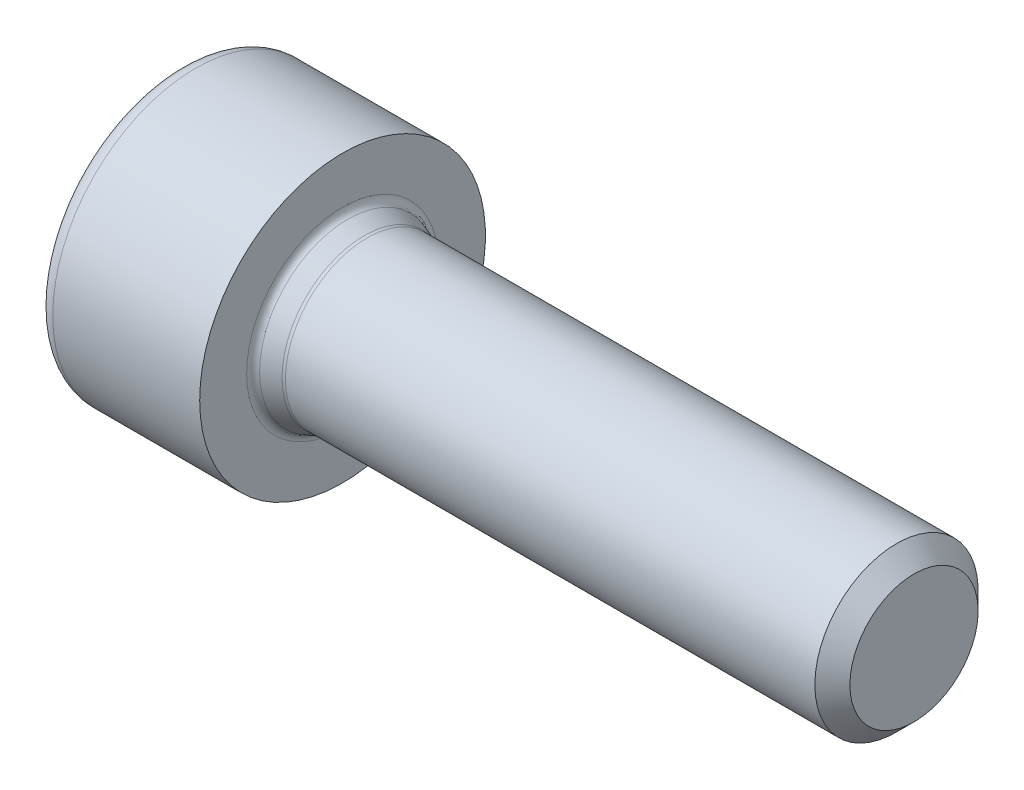
ISO-10303-21;
HEADER;
FILE_DESCRIPTION(('STEP AP214'),'2;1');
FILE_NAME('part.step','',(''),(''),'','','');
FILE_SCHEMA(('AUTOMOTIVE_DESIGN { 1 0 10303 214 1 1 1 1 }'));
ENDSEC;
DATA;
#1=APPLICATION_CONTEXT('core data for automotive mechanical design processes');
#2=APPLICATION_PROTOCOL_DEFINITION('international standard','automotive_design',2000,#1);
#3=PRODUCT_CONTEXT('',#1,'mechanical');
#4=PRODUCT('Part','Part','',(#3));
#5=PRODUCT_RELATED_PRODUCT_CATEGORY('part','',(#4));
#6=PRODUCT_DEFINITION_FORMATION('','',#4);
#7=PRODUCT_DEFINITION_CONTEXT('part definition',#1,'design');
#8=PRODUCT_DEFINITION('design','',#6,#7);
#9=PRODUCT_DEFINITION_SHAPE('','',#8);
#10=(LENGTH_UNIT() NAMED_UNIT(*) SI_UNIT(.MILLI.,.METRE.));
#11=(NAMED_UNIT(*) PLANE_ANGLE_UNIT() SI_UNIT($,.RADIAN.));
#12=(NAMED_UNIT(*) SI_UNIT($,.STERADIAN.) SOLID_ANGLE_UNIT());
#13=UNCERTAINTY_MEASURE_WITH_UNIT(LENGTH_MEASURE(1.E-05),#10,'distance_accuracy_value','');
#14=(GEOMETRIC_REPRESENTATION_CONTEXT(3) GLOBAL_UNCERTAINTY_ASSIGNED_CONTEXT((#13)) GLOBAL_UNIT_ASSIGNED_CONTEXT((#10,
#11,#12)) REPRESENTATION_CONTEXT('',''));
#15=CARTESIAN_POINT('',(0.,0.,0.));
#16=DIRECTION('',(0.,0.,1.));
#17=DIRECTION('',(1.,0.,0.));
#18=AXIS2_PLACEMENT_3D('',#15,#16,#17);
#19=CARTESIAN_POINT('',(-2.,0.,0.));
#20=DIRECTION('',(-1.,0.,0.));
#21=DIRECTION('',(0.,0.,1.));
#22=AXIS2_PLACEMENT_3D('',#19,#20,#21);
#23=CONICAL_SURFACE('',#22,1.50000000000006,1.04719755119661);
#24=CARTESIAN_POINT('',(-1.13397459621556,0.,0.));
#25=VERTEX_POINT('',#24);
#26=VERTEX_LOOP('',#25);
#27=FACE_BOUND('',#26,.T.);
#28=CARTESIAN_POINT('',(-2.,0.,0.));
#29=DIRECTION('',(-1.,0.,0.));
#30=DIRECTION('',(0.,0.,1.));
#31=AXIS2_PLACEMENT_3D('',#28,#29,#30);
#32=CIRCLE('',#31,1.50000000000006);
#33=CARTESIAN_POINT('',(-2.,0.,1.50000000000003));
#34=VERTEX_POINT('',#33);
#35=CARTESIAN_POINT('',(-2.,-1.29903810567668,0.75000000000003));
#36=VERTEX_POINT('',#35);
#37=EDGE_CURVE('E121',#34,#36,#32,.F.);
#38=ORIENTED_EDGE('',*,*,#37,.F.);
#39=CARTESIAN_POINT('',(-2.,0.,0.));
#40=DIRECTION('',(-1.,0.,0.));
#41=DIRECTION('',(0.,0.,1.));
#42=AXIS2_PLACEMENT_3D('',#39,#40,#41);
#43=CIRCLE('',#42,1.50000000000006);
#44=CARTESIAN_POINT('',(-2.,1.29903810567668,0.750000000000031));
#45=VERTEX_POINT('',#44);
#46=EDGE_CURVE('E239',#45,#34,#43,.F.);
#47=ORIENTED_EDGE('',*,*,#46,.F.);
#48=CARTESIAN_POINT('',(-2.,0.,0.));
#49=DIRECTION('',(-1.,0.,0.));
#50=DIRECTION('',(0.,0.,1.));
#51=AXIS2_PLACEMENT_3D('',#48,#49,#50);
#52=CIRCLE('',#51,1.50000000000006);
#53=CARTESIAN_POINT('',(-2.,1.29903810567668,-0.75000000000003));
#54=VERTEX_POINT('',#53);
#55=EDGE_CURVE('E106',#54,#45,#52,.F.);
#56=ORIENTED_EDGE('',*,*,#55,.F.);
#57=CARTESIAN_POINT('',(-2.,0.,0.));
#58=DIRECTION('',(-1.,0.,0.));
#59=DIRECTION('',(0.,0.,1.));
#60=AXIS2_PLACEMENT_3D('',#57,#58,#59);
#61=CIRCLE('',#60,1.50000000000006);
#62=CARTESIAN_POINT('',(-2.,0.,-1.50000000000003));
#63=VERTEX_POINT('',#62);
#64=EDGE_CURVE('E104',#63,#54,#61,.F.);
#65=ORIENTED_EDGE('',*,*,#64,.F.);
#66=CARTESIAN_POINT('',(-2.,0.,0.));
#67=DIRECTION('',(-1.,0.,0.));
#68=DIRECTION('',(0.,0.,1.));
#69=AXIS2_PLACEMENT_3D('',#66,#67,#68);
#70=CIRCLE('',#69,1.50000000000006);
#71=CARTESIAN_POINT('',(-2.,-1.29903810567668,-0.75000000000003));
#72=VERTEX_POINT('',#71);
#73=EDGE_CURVE('E101',#72,#63,#70,.F.);
#74=ORIENTED_EDGE('',*,*,#73,.F.);
#75=CARTESIAN_POINT('',(-2.,0.,0.));
#76=DIRECTION('',(-1.,0.,0.));
#77=DIRECTION('',(0.,0.,1.));
#78=AXIS2_PLACEMENT_3D('',#75,#76,#77);
#79=CIRCLE('',#78,1.50000000000006);
#80=EDGE_CURVE('E243',#36,#72,#79,.F.);
#81=ORIENTED_EDGE('',*,*,#80,.F.);
#82=EDGE_LOOP('',(#38,#47,#56,#65,#74,#81));
#83=FACE_BOUND('',#82,.T.);
#84=ADVANCED_FACE('F16',(#27,#83),#23,.F.);
#85=CARTESIAN_POINT('',(-2.,1.5,0.));
#86=DIRECTION('',(-1.,0.,0.));
#87=DIRECTION('',(0.,0.,1.));
#88=AXIS2_PLACEMENT_3D('',#85,#86,#87);
#89=PLANE('',#88);
#90=DIRECTION('',(0.,1.,0.));
#91=VECTOR('',#90,1.);
#92=CARTESIAN_POINT('',(-2.,-0.86602540378444,-1.5));
#93=LINE('',#92,#91);
#94=CARTESIAN_POINT('',(-2.,-0.86602540378444,-1.5));
#95=VERTEX_POINT('',#94);
#96=EDGE_CURVE('E116',#95,#63,#93,.T.);
#97=ORIENTED_EDGE('',*,*,#96,.F.);
#98=DIRECTION('',(0.,-0.500000000000009,0.866025403784433));
#99=VECTOR('',#98,1.);
#100=CARTESIAN_POINT('',(-2.,-1.7320508075689,0.));
#101=LINE('',#100,#99);
#102=EDGE_CURVE('E119',#72,#95,#101,.F.);
#103=ORIENTED_EDGE('',*,*,#102,.F.);
#104=ORIENTED_EDGE('',*,*,#73,.T.);
#105=EDGE_LOOP('',(#97,#103,#104));
#106=FACE_BOUND('',#105,.T.);
#107=ADVANCED_FACE('F114',(#106),#89,.T.);
#108=CARTESIAN_POINT('',(-2.,1.5,0.));
#109=DIRECTION('',(-1.,0.,0.));
#110=DIRECTION('',(0.,0.,1.));
#111=AXIS2_PLACEMENT_3D('',#108,#109,#110);
#112=PLANE('',#111);
#113=DIRECTION('',(0.,0.500000000000009,0.866025403784433));
#114=VECTOR('',#113,1.);
#115=CARTESIAN_POINT('',(-2.,-0.86602540378444,1.5));
#116=LINE('',#115,#114);
#117=CARTESIAN_POINT('',(-2.,-0.86602540378444,1.5));
#118=VERTEX_POINT('',#117);
#119=EDGE_CURVE('E357',#118,#36,#116,.F.);
#120=ORIENTED_EDGE('',*,*,#119,.F.);
#121=DIRECTION('',(0.,1.,0.));
#122=VECTOR('',#121,1.);
#123=CARTESIAN_POINT('',(-2.,0.86602540378444,1.5));
#124=LINE('',#123,#122);
#125=EDGE_CURVE('E238',#34,#118,#124,.F.);
#126=ORIENTED_EDGE('',*,*,#125,.F.);
#127=ORIENTED_EDGE('',*,*,#37,.T.);
#128=EDGE_LOOP('',(#120,#126,#127));
#129=FACE_BOUND('',#128,.T.);
#130=ADVANCED_FACE('F407',(#129),#112,.T.);
#131=CARTESIAN_POINT('',(-2.,1.5,0.));
#132=DIRECTION('',(-1.,0.,0.));
#133=DIRECTION('',(0.,0.,1.));
#134=AXIS2_PLACEMENT_3D('',#131,#132,#133);
#135=PLANE('',#134);
#136=DIRECTION('',(0.,-0.500000000000009,0.866025403784433));
#137=VECTOR('',#136,1.);
#138=CARTESIAN_POINT('',(-2.,-1.7320508075689,0.));
#139=LINE('',#138,#137);
#140=CARTESIAN_POINT('',(-2.,-1.7320508075689,0.));
#141=VERTEX_POINT('',#140);
#142=EDGE_CURVE('E145',#141,#72,#139,.F.);
#143=ORIENTED_EDGE('',*,*,#142,.F.);
#144=DIRECTION('',(0.,0.500000000000009,0.866025403784433));
#145=VECTOR('',#144,1.);
#146=CARTESIAN_POINT('',(-2.,-0.86602540378444,1.5));
#147=LINE('',#146,#145);
#148=EDGE_CURVE('E353',#36,#141,#147,.F.);
#149=ORIENTED_EDGE('',*,*,#148,.F.);
#150=ORIENTED_EDGE('',*,*,#80,.T.);
#151=EDGE_LOOP('',(#143,#149,#150));
#152=FACE_BOUND('',#151,.T.);
#153=ADVANCED_FACE('F396',(#152),#135,.T.);
#154=CARTESIAN_POINT('',(-2.,1.5,0.));
#155=DIRECTION('',(-1.,0.,0.));
#156=DIRECTION('',(0.,0.,1.));
#157=AXIS2_PLACEMENT_3D('',#154,#155,#156);
#158=PLANE('',#157);
#159=DIRECTION('',(0.,1.,0.));
#160=VECTOR('',#159,1.);
#161=CARTESIAN_POINT('',(-2.,0.86602540378444,1.5));
#162=LINE('',#161,#160);
#163=CARTESIAN_POINT('',(-2.,0.86602540378444,1.5));
#164=VERTEX_POINT('',#163);
#165=EDGE_CURVE('E242',#164,#34,#162,.F.);
#166=ORIENTED_EDGE('',*,*,#165,.F.);
#167=DIRECTION('',(0.,0.500000000000009,-0.866025403784433));
#168=VECTOR('',#167,1.);
#169=CARTESIAN_POINT('',(-2.,1.7320508075689,0.));
#170=LINE('',#169,#168);
#171=EDGE_CURVE('E341',#45,#164,#170,.F.);
#172=ORIENTED_EDGE('',*,*,#171,.F.);
#173=ORIENTED_EDGE('',*,*,#46,.T.);
#174=EDGE_LOOP('',(#166,#172,#173));
#175=FACE_BOUND('',#174,.T.);
#176=ADVANCED_FACE('F229',(#175),#158,.T.);
#177=CARTESIAN_POINT('',(-2.,0.86602540378444,1.5));
#178=DIRECTION('',(0.,0.,-1.));
#179=DIRECTION('',(-1.,0.,0.));
#180=AXIS2_PLACEMENT_3D('',#177,#178,#179);
#181=PLANE('',#180);
#182=CARTESIAN_POINT('',(-3.99541054119479,-0.866025437083564,1.5));
#183=CARTESIAN_POINT('',(-3.97488586949129,-0.794933336251754,1.5));
#184=CARTESIAN_POINT('',(-3.95609495348021,-0.723278833769349,1.5));
#185=CARTESIAN_POINT('',(-3.92288434092945,-0.578805850960488,1.5));
#186=CARTESIAN_POINT('',(-3.90847442472748,-0.505985142856203,1.5));
#187=CARTESIAN_POINT('',(-3.88530153493288,-0.361160840172262,1.5));
#188=CARTESIAN_POINT('',(-3.87641501318682,-0.289177635701394,1.5));
#189=CARTESIAN_POINT('',(-3.86448538482217,-0.144795929732526,1.5));
#190=CARTESIAN_POINT('',(-3.86143593538284,-0.0723979648655872,1.5));
#191=CARTESIAN_POINT('',(-3.86143593538175,0.0723979620501603,1.5));
#192=CARTESIAN_POINT('',(-3.8644853845828,0.144795924098969,1.5));
#193=CARTESIAN_POINT('',(-3.87641501203289,0.289177624478548,1.5));
#194=CARTESIAN_POINT('',(-3.88530153310155,0.361160826178373,1.5));
#195=CARTESIAN_POINT('',(-3.90847442117572,0.505985123272463,1.5));
#196=CARTESIAN_POINT('',(-3.92288433632152,0.578805828560862,1.5));
#197=CARTESIAN_POINT('',(-3.95609494652134,0.723278805849724,1.5));
#198=CARTESIAN_POINT('',(-3.97488586123925,0.794933305627579,1.5));
#199=CARTESIAN_POINT('',(-3.99541053158562,0.866025403796412,1.5));
#200=B_SPLINE_CURVE_WITH_KNOTS('',3,(#182,#183,#184,#185,#186,#187,#188,#189,#190,#191,#192,
#193,#194,#195,#196,#197,#198,#199),.UNSPECIFIED.,.F.,.F.,(4,2,2,2,2,2,2,2,4),(0.,
0.222055055786481,0.44460225734158,0.661973170602298,0.879107744631345,1.09624231021584,
1.31361321499901,1.53616040766414,1.75821545463396),.UNSPECIFIED.);
#201=CARTESIAN_POINT('',(-3.99541053638848,-0.866025420434002,1.5));
#202=VERTEX_POINT('',#201);
#203=CARTESIAN_POINT('',(-3.99541053158393,0.866025403790578,1.5));
#204=VERTEX_POINT('',#203);
#205=EDGE_CURVE('E110',#202,#204,#200,.T.);
#206=ORIENTED_EDGE('',*,*,#205,.T.);
#207=DIRECTION('',(1.,0.,0.));
#208=VECTOR('',#207,1.);
#209=CARTESIAN_POINT('',(-2.,0.86602540378444,1.5));
#210=LINE('',#209,#208);
#211=EDGE_CURVE('E338',#164,#204,#210,.F.);
#212=ORIENTED_EDGE('',*,*,#211,.F.);
#213=ORIENTED_EDGE('',*,*,#165,.T.);
#214=ORIENTED_EDGE('',*,*,#125,.T.);
#215=DIRECTION('',(1.,0.,0.));
#216=VECTOR('',#215,1.);
#217=CARTESIAN_POINT('',(-2.,-0.86602540378444,1.5));
#218=LINE('',#217,#216);
#219=EDGE_CURVE('E344',#202,#118,#218,.T.);
#220=ORIENTED_EDGE('',*,*,#219,.F.);
#221=EDGE_LOOP('',(#206,#212,#213,#214,#220));
#222=FACE_BOUND('',#221,.T.);
#223=ADVANCED_FACE('F225',(#222),#181,.T.);
#224=CARTESIAN_POINT('',(-2.,1.5,0.));
#225=DIRECTION('',(-1.,0.,0.));
#226=DIRECTION('',(0.,0.,1.));
#227=AXIS2_PLACEMENT_3D('',#224,#225,#226);
#228=PLANE('',#227);
#229=DIRECTION('',(0.,-0.500000000000009,-0.866025403784433));
#230=VECTOR('',#229,1.);
#231=CARTESIAN_POINT('',(-2.,0.86602540378444,-1.5));
#232=LINE('',#231,#230);
#233=CARTESIAN_POINT('',(-2.,0.86602540378444,-1.5));
#234=VERTEX_POINT('',#233);
#235=EDGE_CURVE('E127',#234,#54,#232,.F.);
#236=ORIENTED_EDGE('',*,*,#235,.F.);
#237=DIRECTION('',(0.,1.,0.));
#238=VECTOR('',#237,1.);
#239=CARTESIAN_POINT('',(-2.,-0.86602540378444,-1.5));
#240=LINE('',#239,#238);
#241=EDGE_CURVE('E124',#63,#234,#240,.T.);
#242=ORIENTED_EDGE('',*,*,#241,.F.);
#243=ORIENTED_EDGE('',*,*,#64,.T.);
#244=EDGE_LOOP('',(#236,#242,#243));
#245=FACE_BOUND('',#244,.T.);
#246=ADVANCED_FACE('F125',(#245),#228,.T.);
#247=CARTESIAN_POINT('',(-2.,1.5,0.));
#248=DIRECTION('',(-1.,0.,0.));
#249=DIRECTION('',(0.,0.,1.));
#250=AXIS2_PLACEMENT_3D('',#247,#248,#249);
#251=PLANE('',#250);
#252=DIRECTION('',(0.,0.500000000000009,-0.866025403784433));
#253=VECTOR('',#252,1.);
#254=CARTESIAN_POINT('',(-2.,1.7320508075689,0.));
#255=LINE('',#254,#253);
#256=CARTESIAN_POINT('',(-2.,1.7320508075689,0.));
#257=VERTEX_POINT('',#256);
#258=EDGE_CURVE('E347',#257,#45,#255,.F.);
#259=ORIENTED_EDGE('',*,*,#258,.F.);
#260=DIRECTION('',(0.,-0.500000000000009,-0.866025403784433));
#261=VECTOR('',#260,1.);
#262=CARTESIAN_POINT('',(-2.,0.86602540378444,-1.5));
#263=LINE('',#262,#261);
#264=EDGE_CURVE('E335',#54,#257,#263,.F.);
#265=ORIENTED_EDGE('',*,*,#264,.F.);
#266=ORIENTED_EDGE('',*,*,#55,.T.);
#267=EDGE_LOOP('',(#259,#265,#266));
#268=FACE_BOUND('',#267,.T.);
#269=ADVANCED_FACE('F219',(#268),#251,.T.);
#270=CARTESIAN_POINT('',(-2.,-0.86602540378444,-1.5));
#271=DIRECTION('',(0.,0.,1.));
#272=DIRECTION('',(1.,0.,0.));
#273=AXIS2_PLACEMENT_3D('',#270,#271,#272);
#274=PLANE('',#273);
#275=DIRECTION('',(1.,0.,0.));
#276=VECTOR('',#275,1.);
#277=CARTESIAN_POINT('',(-2.,0.86602540378444,-1.5));
#278=LINE('',#277,#276);
#279=CARTESIAN_POINT('',(-3.99541053639157,0.86602542044474,-1.5));
#280=VERTEX_POINT('',#279);
#281=EDGE_CURVE('E211',#280,#234,#278,.T.);
#282=ORIENTED_EDGE('',*,*,#281,.F.);
#283=CARTESIAN_POINT('',(-3.99541054120099,0.86602543710504,-1.5));
#284=CARTESIAN_POINT('',(-3.97488586949389,0.79493333626188,-1.5));
#285=CARTESIAN_POINT('',(-3.95609495347965,0.723278833768002,-1.5));
#286=CARTESIAN_POINT('',(-3.92288434092365,0.578805850934127,-1.5));
#287=CARTESIAN_POINT('',(-3.9084744247197,0.505985142816275,-1.5));
#288=CARTESIAN_POINT('',(-3.88530153492695,0.361160840126681,-1.5));
#289=CARTESIAN_POINT('',(-3.87641501318312,0.289177635663994,-1.5));
#290=CARTESIAN_POINT('',(-3.86448538482122,0.144795929713571,-1.5));
#291=CARTESIAN_POINT('',(-3.8614359353823,0.0723979648569062,-1.5));
#292=CARTESIAN_POINT('',(-3.86143593538229,-0.0723979648586034,-1.5));
#293=CARTESIAN_POINT('',(-3.86448538482137,-0.144795929717448,-1.5));
#294=CARTESIAN_POINT('',(-3.87641501318396,-0.289177635672194,-1.5));
#295=CARTESIAN_POINT('',(-3.8853015349283,-0.361160840137025,-1.5));
#296=CARTESIAN_POINT('',(-3.90847442472236,-0.505985142830945,-1.5));
#297=CARTESIAN_POINT('',(-3.92288434092711,-0.578805850950976,-1.5));
#298=CARTESIAN_POINT('',(-3.95609495348491,-0.723278833789124,-1.5));
#299=CARTESIAN_POINT('',(-3.97488586950014,-0.794933336285095,-1.5));
#300=CARTESIAN_POINT('',(-3.99541054120829,-0.866025437130316,-1.5));
#301=B_SPLINE_CURVE_WITH_KNOTS('',3,(#283,#284,#285,#286,#287,#288,#289,#290,#291,#292,#293,
#294,#295,#296,#297,#298,#299,#300),.UNSPECIFIED.,.F.,.F.,(4,2,2,2,2,2,2,2,4),(0.,
0.222055055822136,0.444602257418287,0.661973170653522,0.879107744653365,1.09624231865974,
1.31361323190153,1.53616043350455,1.7582154893335),.UNSPECIFIED.);
#302=CARTESIAN_POINT('',(-3.99541053639522,-0.866025420457378,-1.5));
#303=VERTEX_POINT('',#302);
#304=EDGE_CURVE('E131',#280,#303,#301,.T.);
#305=ORIENTED_EDGE('',*,*,#304,.T.);
#306=DIRECTION('',(1.,0.,0.));
#307=VECTOR('',#306,1.);
#308=CARTESIAN_POINT('',(-2.,-0.86602540378444,-1.5));
#309=LINE('',#308,#307);
#310=EDGE_CURVE('E135',#95,#303,#309,.F.);
#311=ORIENTED_EDGE('',*,*,#310,.F.);
#312=ORIENTED_EDGE('',*,*,#96,.T.);
#313=ORIENTED_EDGE('',*,*,#241,.T.);
#314=EDGE_LOOP('',(#282,#305,#311,#312,#313));
#315=FACE_BOUND('',#314,.T.);
#316=ADVANCED_FACE('F133',(#315),#274,.T.);
#317=CARTESIAN_POINT('',(-2.,-1.7320508075689,0.));
#318=DIRECTION('',(0.,0.866025403784433,0.500000000000009));
#319=DIRECTION('',(0.,-0.500000000000009,0.866025403784433));
#320=AXIS2_PLACEMENT_3D('',#317,#318,#319);
#321=PLANE('',#320);
#322=CARTESIAN_POINT('',(-3.99541050657917,-0.866025447087952,-1.4999999250181));
#323=CARTESIAN_POINT('',(-3.97343216748451,-0.904082018008368,-1.43408401060801));
#324=CARTESIAN_POINT('',(-3.95344401864991,-0.942467092712413,-1.36759911096249));
#325=CARTESIAN_POINT('',(-3.91855530590697,-1.01990185395574,-1.23347817021286));
#326=CARTESIAN_POINT('',(-3.90366708295429,-1.05895291591256,-1.16583974681568));
#327=CARTESIAN_POINT('',(-3.88049249154354,-1.13657109961256,-1.03140110905719));
#328=CARTESIAN_POINT('',(-3.87205186533514,-1.17512628215169,-0.964621574003915));
#329=CARTESIAN_POINT('',(-3.86197740518625,-1.2524179673689,-0.830748448204806));
#330=CARTESIAN_POINT('',(-3.86033522671843,-1.29115418930565,-0.7636553437172));
#331=CARTESIAN_POINT('',(-3.86376025224939,-1.36352865876884,-0.638299085436183));
#332=CARTESIAN_POINT('',(-3.86798649896052,-1.3971777666977,-0.580017120873993));
#333=CARTESIAN_POINT('',(-3.88137850945855,-1.46425676960319,-0.463832879720616));
#334=CARTESIAN_POINT('',(-3.89054884344853,-1.49768643274478,-0.405931004679481));
#335=CARTESIAN_POINT('',(-3.91347290254472,-1.56490362461831,-0.289507413212423));
#336=CARTESIAN_POINT('',(-3.92732375585939,-1.59868265040315,-0.231000424322908));
#337=CARTESIAN_POINT('',(-3.95875933686368,-1.66573703364317,-0.114858825680989));
#338=CARTESIAN_POINT('',(-3.97633668318845,-1.69901324947923,-0.0572227291693171));
#339=CARTESIAN_POINT('',(-3.99541050659426,-1.73205076428857,-7.49637327050904E-08));
#340=B_SPLINE_CURVE_WITH_KNOTS('',3,(#322,#323,#324,#325,#326,#327,#328,#329,#330,#331,#332,
#333,#334,#335,#336,#337,#338,#339),.UNSPECIFIED.,.F.,.F.,(4,2,2,2,2,2,2,2,4),(0.,
0.237762002732473,0.476095350737683,0.708530687215259,0.940680643971844,1.14278077596489,
1.3450680458849,1.55184107691821,1.7582082999876),.UNSPECIFIED.);
#341=CARTESIAN_POINT('',(-3.99541051908805,-1.73205078592845,-3.748235685595E-08));
#342=VERTEX_POINT('',#341);
#343=EDGE_CURVE('E205',#303,#342,#340,.T.);
#344=ORIENTED_EDGE('',*,*,#343,.T.);
#345=DIRECTION('',(1.,0.,0.));
#346=VECTOR('',#345,1.);
#347=CARTESIAN_POINT('',(-2.,-1.7320508075689,0.));
#348=LINE('',#347,#346);
#349=EDGE_CURVE('E348',#141,#342,#348,.F.);
#350=ORIENTED_EDGE('',*,*,#349,.F.);
#351=ORIENTED_EDGE('',*,*,#142,.T.);
#352=ORIENTED_EDGE('',*,*,#102,.T.);
#353=ORIENTED_EDGE('',*,*,#310,.T.);
#354=EDGE_LOOP('',(#344,#350,#351,#352,#353));
#355=FACE_BOUND('',#354,.T.);
#356=ADVANCED_FACE('F194',(#355),#321,.T.);
#357=CARTESIAN_POINT('',(-2.,-0.86602540378444,1.5));
#358=DIRECTION('',(0.,0.866025403784433,-0.500000000000009));
#359=DIRECTION('',(0.,0.500000000000009,0.866025403784433));
#360=AXIS2_PLACEMENT_3D('',#357,#358,#359);
#361=PLANE('',#360);
#362=CARTESIAN_POINT('',(-3.99541054120298,-1.73205082423262,-2.88624159059352E-08));
#363=CARTESIAN_POINT('',(-3.97343219927167,-1.69399425231402,0.0659158872624992));
#364=CARTESIAN_POINT('',(-3.95344404742431,-1.65560917660879,0.132400788636334));
#365=CARTESIAN_POINT('',(-3.91855532842555,-1.57817441326898,0.266521733012965));
#366=CARTESIAN_POINT('',(-3.90366710223342,-1.53912335021624,0.33416015830987));
#367=CARTESIAN_POINT('',(-3.88049250439667,-1.46150516432566,0.468598799863676));
#368=CARTESIAN_POINT('',(-3.87205187498903,-1.42294998069581,0.535378336805735));
#369=CARTESIAN_POINT('',(-3.86197740866454,-1.34565829316976,0.669251466603576));
#370=CARTESIAN_POINT('',(-3.86033522721807,-1.30692207001514,0.736344573200711));
#371=CARTESIAN_POINT('',(-3.86376024780324,-1.23454759546217,0.861700840297557));
#372=CARTESIAN_POINT('',(-3.8679864929041,-1.20089848368179,0.919982811530734));
#373=CARTESIAN_POINT('',(-3.88137850147018,-1.13381947306077,1.0361670660478));
#374=CARTESIAN_POINT('',(-3.89054883514129,-1.10038980605523,1.09406894778148));
#375=CARTESIAN_POINT('',(-3.91347289478805,-1.03317260631632,1.21049255287179));
#376=CARTESIAN_POINT('',(-3.92732374901373,-0.999393576532945,1.26899954868697));
#377=CARTESIAN_POINT('',(-3.95875933279074,-0.932339185418995,1.38514116096693));
#378=CARTESIAN_POINT('',(-3.9763366809734,-0.899062965707135,1.44277726419169));
#379=CARTESIAN_POINT('',(-3.99541050658369,-0.866025447083062,1.49999992500459));
#380=B_SPLINE_CURVE_WITH_KNOTS('',3,(#362,#363,#364,#365,#366,#367,#368,#369,#370,#371,#372,
#373,#374,#375,#376,#377,#378,#379),.UNSPECIFIED.,.F.,.F.,(4,2,2,2,2,2,2,2,4),(0.,
0.237762010823544,0.476095367128869,0.708530711157204,0.940680675386352,1.14278083006161,
1.34506812275135,1.5518411777889,1.75820842470928),.UNSPECIFIED.);
#381=EDGE_CURVE('E198',#342,#202,#380,.T.);
#382=ORIENTED_EDGE('',*,*,#381,.T.);
#383=ORIENTED_EDGE('',*,*,#219,.T.);
#384=ORIENTED_EDGE('',*,*,#119,.T.);
#385=ORIENTED_EDGE('',*,*,#148,.T.);
#386=ORIENTED_EDGE('',*,*,#349,.T.);
#387=EDGE_LOOP('',(#382,#383,#384,#385,#386));
#388=FACE_BOUND('',#387,.T.);
#389=ADVANCED_FACE('F189',(#388),#361,.T.);
#390=CARTESIAN_POINT('',(-2.,1.7320508075689,0.));
#391=DIRECTION('',(0.,-0.866025403784433,-0.500000000000009));
#392=DIRECTION('',(0.,0.500000000000009,-0.866025403784433));
#393=AXIS2_PLACEMENT_3D('',#390,#391,#392);
#394=PLANE('',#393);
#395=CARTESIAN_POINT('',(-3.99541053158676,0.866025403776942,1.5000000000095));
#396=CARTESIAN_POINT('',(-3.97343219044157,0.904081975420782,1.43408408436272));
#397=CARTESIAN_POINT('',(-3.95344403943038,0.942467050848992,1.36759918346962));
#398=CARTESIAN_POINT('',(-3.91855532216897,1.01990181360735,1.23347824010078));
#399=CARTESIAN_POINT('',(-3.903667096877,1.05895287635547,1.16583981533122));
#400=CARTESIAN_POINT('',(-3.88049250082568,1.1365710616375,1.03140117483128));
#401=CARTESIAN_POINT('',(-3.87205187230683,1.17512624496451,0.964621638413835));
#402=CARTESIAN_POINT('',(-3.86197740769809,1.25241793184938,0.830748509726584));
#403=CARTESIAN_POINT('',(-3.86033522707923,1.29115415466575,0.763655403715309));
#404=CARTESIAN_POINT('',(-3.86376024903855,1.36352862780368,0.638299139069365));
#405=CARTESIAN_POINT('',(-3.86798649458662,1.39717773851295,0.580017169691412));
#406=CARTESIAN_POINT('',(-3.88137850368881,1.46425674698828,0.463832918890804));
#407=CARTESIAN_POINT('',(-3.89054883744805,1.49768641291925,0.405931039018306));
#408=CARTESIAN_POINT('',(-3.91347289694065,1.56490361047084,0.289507437716555));
#409=CARTESIAN_POINT('',(-3.92732375091249,1.59868263914226,0.231000443827346));
#410=CARTESIAN_POINT('',(-3.95875933391752,1.66573702806654,0.114858835339998));
#411=CARTESIAN_POINT('',(-3.9763366815831,1.69901324670058,0.057222733982071));
#412=CARTESIAN_POINT('',(-3.99541050657997,1.73205076426382,7.50065978687364E-08));
#413=B_SPLINE_CURVE_WITH_KNOTS('',3,(#395,#396,#397,#398,#399,#400,#401,#402,#403,#404,#405,
#406,#407,#408,#409,#410,#411,#412),.UNSPECIFIED.,.F.,.F.,(4,2,2,2,2,2,2,2,4),(0.,
0.237762008576515,0.476095362576638,0.708530704507844,0.940680666661629,1.14278081502878,
1.34506810138606,1.55184114974793,1.75820839003528),.UNSPECIFIED.);
#414=CARTESIAN_POINT('',(-3.9954105190812,1.73205078591658,3.75029188322976E-08));
#415=VERTEX_POINT('',#414);
#416=EDGE_CURVE('E171',#204,#415,#413,.T.);
#417=ORIENTED_EDGE('',*,*,#416,.T.);
#418=DIRECTION('',(1.,0.,0.));
#419=VECTOR('',#418,1.);
#420=CARTESIAN_POINT('',(-2.,1.7320508075689,0.));
#421=LINE('',#420,#419);
#422=EDGE_CURVE('E330',#257,#415,#421,.F.);
#423=ORIENTED_EDGE('',*,*,#422,.F.);
#424=ORIENTED_EDGE('',*,*,#258,.T.);
#425=ORIENTED_EDGE('',*,*,#171,.T.);
#426=ORIENTED_EDGE('',*,*,#211,.T.);
#427=EDGE_LOOP('',(#417,#423,#424,#425,#426));
#428=FACE_BOUND('',#427,.T.);
#429=ADVANCED_FACE('F184',(#428),#394,.T.);
#430=CARTESIAN_POINT('',(-2.,0.86602540378444,-1.5));
#431=DIRECTION('',(0.,-0.866025403784433,0.500000000000009));
#432=DIRECTION('',(0.,-0.500000000000009,-0.866025403784433));
#433=AXIS2_PLACEMENT_3D('',#430,#431,#432);
#434=PLANE('',#433);
#435=CARTESIAN_POINT('',(-3.99541054120107,1.73205082422932,2.88566929719456E-08));
#436=CARTESIAN_POINT('',(-3.97343219926991,1.69399425231077,-0.0659158872681368));
#437=CARTESIAN_POINT('',(-3.95344404742272,1.65560917660559,-0.132400788641885));
#438=CARTESIAN_POINT('',(-3.9185553284243,1.57817441326587,-0.266521733018337));
#439=CARTESIAN_POINT('',(-3.90366710223234,1.5391233502132,-0.334160158315149));
#440=CARTESIAN_POINT('',(-3.88049250439595,1.46150516432274,-0.468598799868747));
#441=CARTESIAN_POINT('',(-3.87205187498849,1.42294998069295,-0.535378336810692));
#442=CARTESIAN_POINT('',(-3.86197740866435,1.34565829316704,-0.669251466608292));
#443=CARTESIAN_POINT('',(-3.86033522721804,1.30692207001249,-0.736344573205299));
#444=CARTESIAN_POINT('',(-3.86376024780355,1.23454759545841,-0.861700840304071));
#445=CARTESIAN_POINT('',(-3.86798649290479,1.20089848367684,-0.919982811539297));
#446=CARTESIAN_POINT('',(-3.88137850147193,1.13381947305348,-1.03616706606042));
#447=CARTESIAN_POINT('',(-3.89054883514375,1.10038980604679,-1.09406894779611));
#448=CARTESIAN_POINT('',(-3.91347289479217,1.03317260630553,-1.21049255289048));
#449=CARTESIAN_POINT('',(-3.92732374901882,0.999393576520972,-1.26899954870771));
#450=CARTESIAN_POINT('',(-3.95875933279796,0.932339185404701,-1.38514116099168));
#451=CARTESIAN_POINT('',(-3.97633668098176,0.899062965691704,-1.44277726421842));
#452=CARTESIAN_POINT('',(-3.99541050659325,0.866025447066508,-1.49999992503326));
#453=B_SPLINE_CURVE_WITH_KNOTS('',3,(#435,#436,#437,#438,#439,#440,#441,#442,#443,#444,#445,
#446,#447,#448,#449,#450,#451,#452),.UNSPECIFIED.,.F.,.F.,(4,2,2,2,2,2,2,2,4),(0.,
0.237762010823131,0.476095367128037,0.708530711155922,0.940680675384621,1.14278083006702,
1.34506812276392,1.551841177809,1.75820842473685),.UNSPECIFIED.);
#454=EDGE_CURVE('E162',#415,#280,#453,.T.);
#455=ORIENTED_EDGE('',*,*,#454,.T.);
#456=ORIENTED_EDGE('',*,*,#281,.T.);
#457=ORIENTED_EDGE('',*,*,#235,.T.);
#458=ORIENTED_EDGE('',*,*,#264,.T.);
#459=ORIENTED_EDGE('',*,*,#422,.T.);
#460=EDGE_LOOP('',(#455,#456,#457,#458,#459));
#461=FACE_BOUND('',#460,.T.);
#462=ADVANCED_FACE('F181',(#461),#434,.T.);
#463=CARTESIAN_POINT('',(-3.99999999996226,0.,0.));
#464=DIRECTION('',(-1.,0.,0.));
#465=DIRECTION('',(0.,0.,1.));
#466=AXIS2_PLACEMENT_3D('',#463,#464,#465);
#467=CONICAL_SURFACE('',#466,1.73999999998387,1.04719755124733);
#468=ORIENTED_EDGE('',*,*,#205,.F.);
#469=ORIENTED_EDGE('',*,*,#381,.F.);
#470=ORIENTED_EDGE('',*,*,#343,.F.);
#471=ORIENTED_EDGE('',*,*,#304,.F.);
#472=ORIENTED_EDGE('',*,*,#454,.F.);
#473=ORIENTED_EDGE('',*,*,#416,.F.);
#474=EDGE_LOOP('',(#468,#469,#470,#471,#472,#473));
#475=FACE_BOUND('',#474,.T.);
#476=CARTESIAN_POINT('',(-3.99999999996226,0.,0.));
#477=DIRECTION('',(-1.,0.,0.));
#478=DIRECTION('',(0.,0.,1.));
#479=AXIS2_PLACEMENT_3D('',#476,#477,#478);
#480=CIRCLE('',#479,1.73999999998387);
#481=CARTESIAN_POINT('',(-3.99999999996226,0.,1.73999999998387));
#482=VERTEX_POINT('',#481);
#483=EDGE_CURVE('E158',#482,#482,#480,.T.);
#484=ORIENTED_EDGE('',*,*,#483,.T.);
#485=EDGE_LOOP('',(#484));
#486=FACE_BOUND('',#485,.T.);
#487=ADVANCED_FACE('F178',(#475,#486),#467,.F.);
#488=CARTESIAN_POINT('',(-4.,0.,0.));
#489=DIRECTION('',(1.,0.,0.));
#490=DIRECTION('',(0.,0.,-1.));
#491=AXIS2_PLACEMENT_3D('',#488,#489,#490);
#492=PLANE('',#491);
#493=CARTESIAN_POINT('',(-4.,0.,0.));
#494=DIRECTION('',(1.,0.,0.));
#495=DIRECTION('',(0.,0.,1.));
#496=AXIS2_PLACEMENT_3D('',#493,#494,#495);
#497=CIRCLE('',#496,3.1);
#498=CARTESIAN_POINT('',(-4.,0.,3.09999999999999));
#499=VERTEX_POINT('',#498);
#500=CARTESIAN_POINT('',(-4.,0.,-3.09999999999999));
#501=VERTEX_POINT('',#500);
#502=EDGE_CURVE('E161',#499,#501,#497,.T.);
#503=ORIENTED_EDGE('',*,*,#502,.F.);
#504=CARTESIAN_POINT('',(-4.,0.,0.));
#505=DIRECTION('',(1.,0.,0.));
#506=DIRECTION('',(0.,0.,-1.));
#507=AXIS2_PLACEMENT_3D('',#504,#505,#506);
#508=CIRCLE('',#507,3.1);
#509=EDGE_CURVE('E305',#501,#499,#508,.T.);
#510=ORIENTED_EDGE('',*,*,#509,.F.);
#511=EDGE_LOOP('',(#503,#510));
#512=FACE_BOUND('',#511,.T.);
#513=ORIENTED_EDGE('',*,*,#483,.F.);
#514=EDGE_LOOP('',(#513));
#515=FACE_BOUND('',#514,.T.);
#516=ADVANCED_FACE('F313',(#512,#515),#492,.F.);
#517=CARTESIAN_POINT('',(-3.59999999999994,0.,0.));
#518=DIRECTION('',(-1.,0.,0.));
#519=DIRECTION('',(0.,0.,1.));
#520=AXIS2_PLACEMENT_3D('',#517,#518,#519);
#521=TOROIDAL_SURFACE('',#520,3.09999999999994,0.400000000000065);
#522=ORIENTED_EDGE('',*,*,#502,.T.);
#523=ORIENTED_EDGE('',*,*,#509,.T.);
#524=EDGE_LOOP('',(#522,#523));
#525=FACE_BOUND('',#524,.T.);
#526=CARTESIAN_POINT('',(-3.6,0.,0.));
#527=DIRECTION('',(-1.,0.,0.));
#528=DIRECTION('',(0.,0.,1.));
#529=AXIS2_PLACEMENT_3D('',#526,#527,#528);
#530=CIRCLE('',#529,3.5);
#531=CARTESIAN_POINT('',(-3.6,0.,3.5));
#532=VERTEX_POINT('',#531);
#533=EDGE_CURVE('E157',#532,#532,#530,.F.);
#534=ORIENTED_EDGE('',*,*,#533,.F.);
#535=EDGE_LOOP('',(#534));
#536=FACE_BOUND('',#535,.T.);
#537=ADVANCED_FACE('F309',(#525,#536),#521,.T.);
#538=CARTESIAN_POINT('',(14.,0.,0.));
#539=DIRECTION('',(-1.,0.,0.));
#540=DIRECTION('',(0.,0.,1.));
#541=AXIS2_PLACEMENT_3D('',#538,#539,#540);
#542=CYLINDRICAL_SURFACE('',#541,3.5);
#543=ORIENTED_EDGE('',*,*,#533,.T.);
#544=EDGE_LOOP('',(#543));
#545=FACE_BOUND('',#544,.T.);
#546=CARTESIAN_POINT('',(0.,0.,0.));
#547=DIRECTION('',(-1.,0.,0.));
#548=DIRECTION('',(0.,0.,1.));
#549=AXIS2_PLACEMENT_3D('',#546,#547,#548);
#550=CIRCLE('',#549,3.5);
#551=CARTESIAN_POINT('',(0.,0.,3.5));
#552=VERTEX_POINT('',#551);
#553=EDGE_CURVE('E153',#552,#552,#550,.T.);
#554=ORIENTED_EDGE('',*,*,#553,.T.);
#555=EDGE_LOOP('',(#554));
#556=FACE_BOUND('',#555,.T.);
#557=ADVANCED_FACE('F312',(#545,#556),#542,.T.);
#558=CARTESIAN_POINT('',(0.,0.,-3.5));
#559=DIRECTION('',(-1.,0.,0.));
#560=DIRECTION('',(0.,0.,1.));
#561=AXIS2_PLACEMENT_3D('',#558,#559,#560);
#562=PLANE('',#561);
#563=ORIENTED_EDGE('',*,*,#553,.F.);
#564=EDGE_LOOP('',(#563));
#565=FACE_BOUND('',#564,.T.);
#566=CARTESIAN_POINT('',(0.,0.,0.));
#567=DIRECTION('',(1.,0.,0.));
#568=DIRECTION('',(0.,0.,1.));
#569=AXIS2_PLACEMENT_3D('',#566,#567,#568);
#570=CIRCLE('',#569,2.35000000000002);
#571=CARTESIAN_POINT('',(0.,0.,-2.35000000000002));
#572=VERTEX_POINT('',#571);
#573=CARTESIAN_POINT('',(0.,0.,2.35000000000002));
#574=VERTEX_POINT('',#573);
#575=EDGE_CURVE('E156',#572,#574,#570,.F.);
#576=ORIENTED_EDGE('',*,*,#575,.T.);
#577=CARTESIAN_POINT('',(0.,0.,0.));
#578=DIRECTION('',(1.,0.,0.));
#579=DIRECTION('',(0.,0.,-1.));
#580=AXIS2_PLACEMENT_3D('',#577,#578,#579);
#581=CIRCLE('',#580,2.35000000000002);
#582=EDGE_CURVE('E35',#574,#572,#581,.F.);
#583=ORIENTED_EDGE('',*,*,#582,.T.);
#584=EDGE_LOOP('',(#576,#583));
#585=FACE_BOUND('',#584,.T.);
#586=ADVANCED_FACE('F264',(#565,#585),#562,.F.);
#587=CARTESIAN_POINT('',(0.200000000000031,0.,0.));
#588=DIRECTION('',(-1.,0.,0.));
#589=DIRECTION('',(0.,0.,1.));
#590=AXIS2_PLACEMENT_3D('',#587,#588,#589);
#591=TOROIDAL_SURFACE('',#590,2.35000000000003,0.200000000000031);
#592=ORIENTED_EDGE('',*,*,#582,.F.);
#593=ORIENTED_EDGE('',*,*,#575,.F.);
#594=EDGE_LOOP('',(#592,#593));
#595=FACE_BOUND('',#594,.T.);
#596=CARTESIAN_POINT('',(0.129775311677349,0.,0.));
#597=DIRECTION('',(-1.,0.,0.));
#598=DIRECTION('',(0.,0.,1.));
#599=AXIS2_PLACEMENT_3D('',#596,#597,#598);
#600=CIRCLE('',#599,2.16273416447166);
#601=CARTESIAN_POINT('',(0.129775311677349,0.,2.16273416447166));
#602=VERTEX_POINT('',#601);
#603=EDGE_CURVE('E152',#602,#602,#600,.F.);
#604=ORIENTED_EDGE('',*,*,#603,.F.);
#605=EDGE_LOOP('',(#604));
#606=FACE_BOUND('',#605,.T.);
#607=ADVANCED_FACE('F252',(#595,#606),#591,.F.);
#608=CARTESIAN_POINT('',(14.,0.,-1.5705));
#609=DIRECTION('',(-1.,0.,0.));
#610=DIRECTION('',(0.,0.,1.));
#611=AXIS2_PLACEMENT_3D('',#608,#609,#610);
#612=PLANE('',#611);
#613=CARTESIAN_POINT('',(13.9999999999532,0.,0.));
#614=DIRECTION('',(-1.,0.,0.));
#615=DIRECTION('',(0.,0.,1.));
#616=AXIS2_PLACEMENT_3D('',#613,#614,#615);
#617=CIRCLE('',#616,1.57050000001391);
#618=CARTESIAN_POINT('',(13.9999999999532,0.,1.57050000001391));
#619=VERTEX_POINT('',#618);
#620=EDGE_CURVE('E148',#619,#619,#617,.T.);
#621=ORIENTED_EDGE('',*,*,#620,.F.);
#622=EDGE_LOOP('',(#621));
#623=FACE_BOUND('',#622,.T.);
#624=ADVANCED_FACE('F263',(#623),#612,.F.);
#625=CARTESIAN_POINT('',(0.129775311904723,0.,0.));
#626=DIRECTION('',(-1.,0.,0.));
#627=DIRECTION('',(0.,0.,1.));
#628=AXIS2_PLACEMENT_3D('',#625,#626,#627);
#629=CONICAL_SURFACE('',#628,2.16273416441481,0.358770670286146);
#630=ORIENTED_EDGE('',*,*,#603,.T.);
#631=EDGE_LOOP('',(#630));
#632=FACE_BOUND('',#631,.T.);
#633=CARTESIAN_POINT('',(0.52977531168232,0.,0.));
#634=DIRECTION('',(-1.,0.,0.));
#635=DIRECTION('',(0.,0.,1.));
#636=AXIS2_PLACEMENT_3D('',#633,#634,#635);
#637=CIRCLE('',#636,2.0127341644862);
#638=CARTESIAN_POINT('',(0.52977531168232,0.,2.0127341644862));
#639=VERTEX_POINT('',#638);
#640=EDGE_CURVE('E151',#639,#639,#637,.T.);
#641=ORIENTED_EDGE('',*,*,#640,.T.);
#642=EDGE_LOOP('',(#641));
#643=FACE_BOUND('',#642,.T.);
#644=ADVANCED_FACE('F436',(#632,#643),#629,.T.);
#645=CARTESIAN_POINT('',(13.5705000000144,0.,0.));
#646=DIRECTION('',(-1.,0.,0.));
#647=DIRECTION('',(0.,0.,1.));
#648=AXIS2_PLACEMENT_3D('',#645,#646,#647);
#649=CONICAL_SURFACE('',#648,1.99999999995271,0.785398163397448);
#650=CARTESIAN_POINT('',(13.5705,0.,0.));
#651=DIRECTION('',(-1.,0.,0.));
#652=DIRECTION('',(0.,0.,1.));
#653=AXIS2_PLACEMENT_3D('',#650,#651,#652);
#654=CIRCLE('',#653,2.);
#655=CARTESIAN_POINT('',(13.5705,0.,2.));
#656=VERTEX_POINT('',#655);
#657=EDGE_CURVE('E27',#656,#656,#654,.T.);
#658=ORIENTED_EDGE('',*,*,#657,.F.);
#659=EDGE_LOOP('',(#658));
#660=FACE_BOUND('',#659,.T.);
#661=ORIENTED_EDGE('',*,*,#620,.T.);
#662=EDGE_LOOP('',(#661));
#663=FACE_BOUND('',#662,.T.);
#664=ADVANCED_FACE('F424',(#660,#663),#649,.T.);
#665=CARTESIAN_POINT('',(0.599999999999557,0.,0.));
#666=DIRECTION('',(-1.,0.,0.));
#667=DIRECTION('',(0.,0.,1.));
#668=AXIS2_PLACEMENT_3D('',#665,#666,#667);
#669=TOROIDAL_SURFACE('',#668,2.19999999999744,0.199999999997438);
#670=ORIENTED_EDGE('',*,*,#640,.F.);
#671=EDGE_LOOP('',(#670));
#672=FACE_BOUND('',#671,.T.);
#673=CARTESIAN_POINT('',(0.6,0.,0.));
#674=DIRECTION('',(-1.,0.,0.));
#675=DIRECTION('',(0.,0.,1.));
#676=AXIS2_PLACEMENT_3D('',#673,#674,#675);
#677=CIRCLE('',#676,2.);
#678=CARTESIAN_POINT('',(0.6,0.,2.));
#679=VERTEX_POINT('',#678);
#680=EDGE_CURVE('E11',#679,#679,#677,.F.);
#681=ORIENTED_EDGE('',*,*,#680,.F.);
#682=EDGE_LOOP('',(#681));
#683=FACE_BOUND('',#682,.T.);
#684=ADVANCED_FACE('F418',(#672,#683),#669,.F.);
#685=CARTESIAN_POINT('',(14.,0.,0.));
#686=DIRECTION('',(-1.,0.,0.));
#687=DIRECTION('',(0.,0.,1.));
#688=AXIS2_PLACEMENT_3D('',#685,#686,#687);
#689=CYLINDRICAL_SURFACE('',#688,2.);
#690=ORIENTED_EDGE('',*,*,#680,.T.);
#691=EDGE_LOOP('',(#690));
#692=FACE_BOUND('',#691,.T.);
#693=ORIENTED_EDGE('',*,*,#657,.T.);
#694=EDGE_LOOP('',(#693));
#695=FACE_BOUND('',#694,.T.);
#696=ADVANCED_FACE('F416',(#692,#695),#689,.T.);
#697=CLOSED_SHELL('',(#84,#107,#130,#153,#176,#223,#246,#269,#316,#356,#389,#429,#462,#487,#516,
#537,#557,#586,#607,#624,#644,#664,#684,#696));
#698=MANIFOLD_SOLID_BREP('B1',#697);
#699=ADVANCED_BREP_SHAPE_REPRESENTATION('',(#18,#698),#14);
#700=SHAPE_DEFINITION_REPRESENTATION(#9,#699);
ENDSEC;
END-ISO-10303-21;
